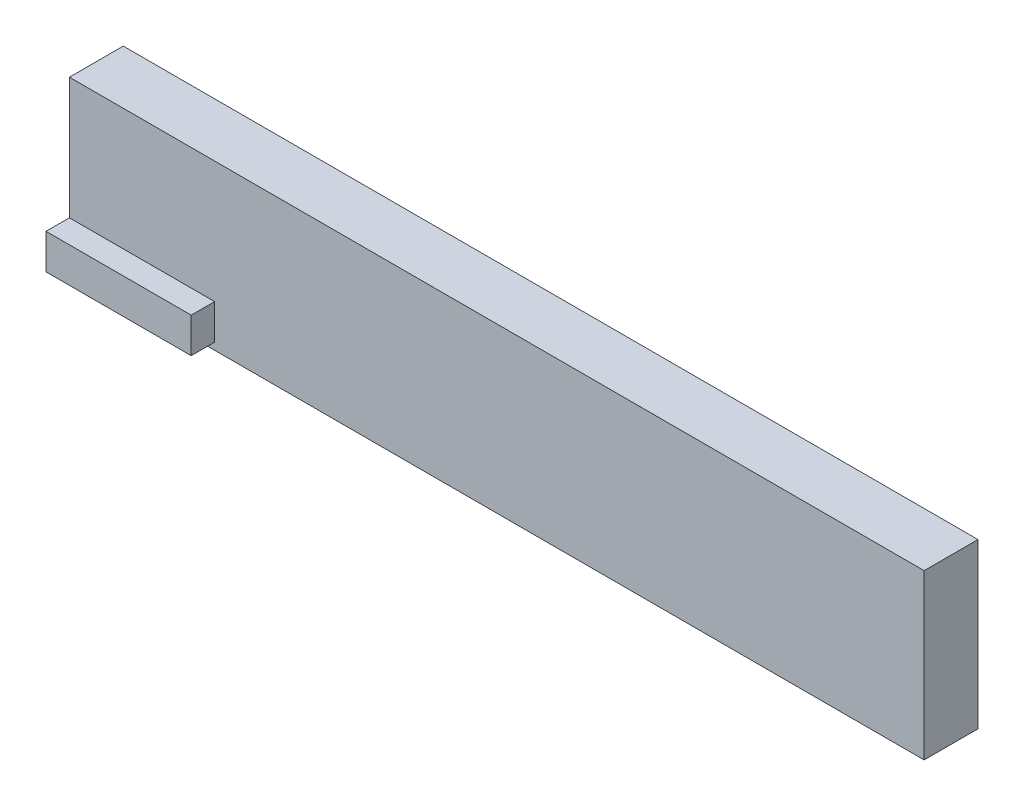
ISO-10303-21;
HEADER;
FILE_DESCRIPTION(('STEP AP214'),'2;1');
FILE_NAME('part.step','',(''),(''),'','','');
FILE_SCHEMA(('AUTOMOTIVE_DESIGN { 1 0 10303 214 1 1 1 1 }'));
ENDSEC;
DATA;
#1=APPLICATION_CONTEXT('core data for automotive mechanical design processes');
#2=APPLICATION_PROTOCOL_DEFINITION('international standard','automotive_design',2000,#1);
#3=PRODUCT_CONTEXT('',#1,'mechanical');
#4=PRODUCT('Part','Part','',(#3));
#5=PRODUCT_RELATED_PRODUCT_CATEGORY('part','',(#4));
#6=PRODUCT_DEFINITION_FORMATION('','',#4);
#7=PRODUCT_DEFINITION_CONTEXT('part definition',#1,'design');
#8=PRODUCT_DEFINITION('design','',#6,#7);
#9=PRODUCT_DEFINITION_SHAPE('','',#8);
#10=(LENGTH_UNIT() NAMED_UNIT(*) SI_UNIT(.MILLI.,.METRE.));
#11=(NAMED_UNIT(*) PLANE_ANGLE_UNIT() SI_UNIT($,.RADIAN.));
#12=(NAMED_UNIT(*) SI_UNIT($,.STERADIAN.) SOLID_ANGLE_UNIT());
#13=UNCERTAINTY_MEASURE_WITH_UNIT(LENGTH_MEASURE(1.E-05),#10,'distance_accuracy_value','');
#14=(GEOMETRIC_REPRESENTATION_CONTEXT(3) GLOBAL_UNCERTAINTY_ASSIGNED_CONTEXT((#13)) GLOBAL_UNIT_ASSIGNED_CONTEXT((#10,
#11,#12)) REPRESENTATION_CONTEXT('',''));
#15=CARTESIAN_POINT('',(0.,0.,0.));
#16=DIRECTION('',(0.,0.,1.));
#17=DIRECTION('',(1.,0.,0.));
#18=AXIS2_PLACEMENT_3D('',#15,#16,#17);
#19=CARTESIAN_POINT('',(0.,0.,2.30000000000002));
#20=DIRECTION('',(1.,0.,0.));
#21=DIRECTION('',(0.,1.,0.));
#22=AXIS2_PLACEMENT_3D('',#19,#20,#21);
#23=PLANE('',#22);
#24=CARTESIAN_POINT('',(0.,-5.9343279526015,2.77991268216593));
#25=DIRECTION('',(-1.,0.,0.));
#26=DIRECTION('',(0.,-1.,0.));
#27=AXIS2_PLACEMENT_3D('',#24,#25,#26);
#28=CIRCLE('',#27,0.5);
#29=CARTESIAN_POINT('',(0.,-6.4343279526015,2.77991268216593));
#30=VERTEX_POINT('',#29);
#31=EDGE_CURVE('E207',#30,#30,#28,.T.);
#32=ORIENTED_EDGE('',*,*,#31,.F.);
#33=EDGE_LOOP('',(#32));
#34=FACE_BOUND('',#33,.T.);
#35=DIRECTION('',(0.,-1.,0.));
#36=VECTOR('',#35,1.);
#37=CARTESIAN_POINT('',(0.,0.,0.));
#38=LINE('',#37,#36);
#39=CARTESIAN_POINT('',(0.,0.,0.));
#40=VERTEX_POINT('',#39);
#41=CARTESIAN_POINT('',(1.2490009027033E-13,-7.00000000000012,-1.38777878078145E-13));
#42=VERTEX_POINT('',#41);
#43=EDGE_CURVE('E126',#40,#42,#38,.T.);
#44=ORIENTED_EDGE('',*,*,#43,.T.);
#45=DIRECTION('',(0.,0.,-1.));
#46=VECTOR('',#45,1.);
#47=CARTESIAN_POINT('',(0.,-7.00000000000001,2.3));
#48=LINE('',#47,#46);
#49=CARTESIAN_POINT('',(0.,-7.00000000000001,2.3));
#50=VERTEX_POINT('',#49);
#51=EDGE_CURVE('E11',#50,#42,#48,.T.);
#52=ORIENTED_EDGE('',*,*,#51,.F.);
#53=DIRECTION('',(0.,-1.,0.));
#54=VECTOR('',#53,1.);
#55=CARTESIAN_POINT('',(0.,0.,2.30000000000002));
#56=LINE('',#55,#54);
#57=CARTESIAN_POINT('',(0.,-6.70000000000001,2.3));
#58=VERTEX_POINT('',#57);
#59=EDGE_CURVE('E124',#58,#50,#56,.T.);
#60=ORIENTED_EDGE('',*,*,#59,.F.);
#61=DIRECTION('',(0.,0.,-1.));
#62=VECTOR('',#61,1.);
#63=CARTESIAN_POINT('',(1.38777878078145E-13,-6.70000000000001,3.3));
#64=LINE('',#63,#62);
#65=CARTESIAN_POINT('',(1.38777878078145E-13,-6.70000000000001,3.3));
#66=VERTEX_POINT('',#65);
#67=EDGE_CURVE('E104',#66,#58,#64,.T.);
#68=ORIENTED_EDGE('',*,*,#67,.F.);
#69=DIRECTION('',(0.,-1.,0.));
#70=VECTOR('',#69,1.);
#71=CARTESIAN_POINT('',(1.31838984174237E-13,-5.20000000000007,3.3));
#72=LINE('',#71,#70);
#73=CARTESIAN_POINT('',(1.31838984174237E-13,-5.20000000000007,3.3));
#74=VERTEX_POINT('',#73);
#75=EDGE_CURVE('E111',#74,#66,#72,.T.);
#76=ORIENTED_EDGE('',*,*,#75,.F.);
#77=DIRECTION('',(0.,0.,-1.));
#78=VECTOR('',#77,1.);
#79=CARTESIAN_POINT('',(1.31838984174237E-13,-5.20000000000007,3.3));
#80=LINE('',#79,#78);
#81=CARTESIAN_POINT('',(0.,-5.20000000000005,2.30000000000027));
#82=VERTEX_POINT('',#81);
#83=EDGE_CURVE('E185',#74,#82,#80,.T.);
#84=ORIENTED_EDGE('',*,*,#83,.T.);
#85=CARTESIAN_POINT('',(0.,0.,2.30000000000002));
#86=VERTEX_POINT('',#85);
#87=EDGE_CURVE('E138',#86,#82,#56,.T.);
#88=ORIENTED_EDGE('',*,*,#87,.F.);
#89=DIRECTION('',(0.,0.,-1.));
#90=VECTOR('',#89,1.);
#91=CARTESIAN_POINT('',(0.,0.,2.30000000000002));
#92=LINE('',#91,#90);
#93=EDGE_CURVE('E149',#86,#40,#92,.T.);
#94=ORIENTED_EDGE('',*,*,#93,.T.);
#95=EDGE_LOOP('',(#44,#52,#60,#68,#76,#84,#88,#94));
#96=FACE_BOUND('',#95,.T.);
#97=ADVANCED_FACE('F36',(#34,#96),#23,.F.);
#98=CARTESIAN_POINT('',(0.,-7.00000000000001,2.3));
#99=DIRECTION('',(0.,1.,0.));
#100=DIRECTION('',(0.,0.,1.));
#101=AXIS2_PLACEMENT_3D('',#98,#99,#100);
#102=PLANE('',#101);
#103=DIRECTION('',(1.,0.,0.));
#104=VECTOR('',#103,1.);
#105=CARTESIAN_POINT('',(1.2490009027033E-13,-7.00000000000012,-1.38777878078145E-13));
#106=LINE('',#105,#104);
#107=CARTESIAN_POINT('',(36.5000000000001,-6.99999999999999,2.22044604925031E-13));
#108=VERTEX_POINT('',#107);
#109=EDGE_CURVE('E131',#42,#108,#106,.T.);
#110=ORIENTED_EDGE('',*,*,#109,.T.);
#111=DIRECTION('',(0.,0.,-1.));
#112=VECTOR('',#111,1.);
#113=CARTESIAN_POINT('',(36.5000000000001,-7.00000000000002,2.29999999999994));
#114=LINE('',#113,#112);
#115=CARTESIAN_POINT('',(36.5000000000001,-7.00000000000002,2.29999999999994));
#116=VERTEX_POINT('',#115);
#117=EDGE_CURVE('E44',#116,#108,#114,.T.);
#118=ORIENTED_EDGE('',*,*,#117,.F.);
#119=DIRECTION('',(1.,0.,0.));
#120=VECTOR('',#119,1.);
#121=CARTESIAN_POINT('',(0.,-7.00000000000001,2.3));
#122=LINE('',#121,#120);
#123=EDGE_CURVE('E141',#50,#116,#122,.T.);
#124=ORIENTED_EDGE('',*,*,#123,.F.);
#125=ORIENTED_EDGE('',*,*,#51,.T.);
#126=EDGE_LOOP('',(#110,#118,#124,#125));
#127=FACE_BOUND('',#126,.T.);
#128=ADVANCED_FACE('F218',(#127),#102,.F.);
#129=CARTESIAN_POINT('',(36.5000000000001,0.,2.29999999999994));
#130=DIRECTION('',(-1.,0.,0.));
#131=DIRECTION('',(0.,0.,1.));
#132=AXIS2_PLACEMENT_3D('',#129,#130,#131);
#133=PLANE('',#132);
#134=DIRECTION('',(0.,1.,0.));
#135=VECTOR('',#134,1.);
#136=CARTESIAN_POINT('',(36.5000000000001,0.,0.));
#137=LINE('',#136,#135);
#138=CARTESIAN_POINT('',(36.5000000000001,0.,0.));
#139=VERTEX_POINT('',#138);
#140=EDGE_CURVE('E153',#108,#139,#137,.T.);
#141=ORIENTED_EDGE('',*,*,#140,.T.);
#142=DIRECTION('',(0.,0.,-1.));
#143=VECTOR('',#142,1.);
#144=CARTESIAN_POINT('',(36.5000000000001,0.,2.29999999999994));
#145=LINE('',#144,#143);
#146=CARTESIAN_POINT('',(36.5000000000001,0.,2.29999999999994));
#147=VERTEX_POINT('',#146);
#148=EDGE_CURVE('E162',#147,#139,#145,.T.);
#149=ORIENTED_EDGE('',*,*,#148,.F.);
#150=DIRECTION('',(0.,1.,0.));
#151=VECTOR('',#150,1.);
#152=CARTESIAN_POINT('',(36.5000000000001,0.,2.29999999999994));
#153=LINE('',#152,#151);
#154=EDGE_CURVE('E144',#116,#147,#153,.T.);
#155=ORIENTED_EDGE('',*,*,#154,.F.);
#156=ORIENTED_EDGE('',*,*,#117,.T.);
#157=EDGE_LOOP('',(#141,#149,#155,#156));
#158=FACE_BOUND('',#157,.T.);
#159=ADVANCED_FACE('F172',(#158),#133,.F.);
#160=CARTESIAN_POINT('',(0.,0.,2.30000000000002));
#161=DIRECTION('',(0.,-1.,0.));
#162=DIRECTION('',(0.,0.,-1.));
#163=AXIS2_PLACEMENT_3D('',#160,#161,#162);
#164=PLANE('',#163);
#165=DIRECTION('',(-1.,0.,0.));
#166=VECTOR('',#165,1.);
#167=CARTESIAN_POINT('',(0.,0.,0.));
#168=LINE('',#167,#166);
#169=EDGE_CURVE('E156',#139,#40,#168,.T.);
#170=ORIENTED_EDGE('',*,*,#169,.T.);
#171=ORIENTED_EDGE('',*,*,#93,.F.);
#172=DIRECTION('',(-1.,0.,0.));
#173=VECTOR('',#172,1.);
#174=CARTESIAN_POINT('',(0.,0.,2.30000000000002));
#175=LINE('',#174,#173);
#176=EDGE_CURVE('E147',#147,#86,#175,.T.);
#177=ORIENTED_EDGE('',*,*,#176,.F.);
#178=ORIENTED_EDGE('',*,*,#148,.T.);
#179=EDGE_LOOP('',(#170,#171,#177,#178));
#180=FACE_BOUND('',#179,.T.);
#181=ADVANCED_FACE('F182',(#180),#164,.F.);
#182=CARTESIAN_POINT('',(0.,0.,2.30000000000002));
#183=DIRECTION('',(0.,0.,1.));
#184=DIRECTION('',(1.,0.,0.));
#185=AXIS2_PLACEMENT_3D('',#182,#183,#184);
#186=PLANE('',#185);
#187=DIRECTION('',(-1.,0.,0.));
#188=VECTOR('',#187,1.);
#189=CARTESIAN_POINT('',(0.,-5.20000000000005,2.30000000000027));
#190=LINE('',#189,#188);
#191=CARTESIAN_POINT('',(6.19999999999999,-5.20000000000001,2.30000000000027));
#192=VERTEX_POINT('',#191);
#193=EDGE_CURVE('E51',#192,#82,#190,.T.);
#194=ORIENTED_EDGE('',*,*,#193,.F.);
#195=DIRECTION('',(0.,1.,0.));
#196=VECTOR('',#195,1.);
#197=CARTESIAN_POINT('',(6.19999999999999,-5.20000000000001,2.30000000000027));
#198=LINE('',#197,#196);
#199=CARTESIAN_POINT('',(6.20000000000012,-6.7000000000001,2.30000000000027));
#200=VERTEX_POINT('',#199);
#201=EDGE_CURVE('E192',#200,#192,#198,.T.);
#202=ORIENTED_EDGE('',*,*,#201,.F.);
#203=DIRECTION('',(1.,0.,0.));
#204=VECTOR('',#203,1.);
#205=CARTESIAN_POINT('',(0.,-6.70000000000001,2.3));
#206=LINE('',#205,#204);
#207=EDGE_CURVE('E57',#58,#200,#206,.T.);
#208=ORIENTED_EDGE('',*,*,#207,.F.);
#209=ORIENTED_EDGE('',*,*,#59,.T.);
#210=ORIENTED_EDGE('',*,*,#123,.T.);
#211=ORIENTED_EDGE('',*,*,#154,.T.);
#212=ORIENTED_EDGE('',*,*,#176,.T.);
#213=ORIENTED_EDGE('',*,*,#87,.T.);
#214=EDGE_LOOP('',(#194,#202,#208,#209,#210,#211,#212,#213));
#215=FACE_BOUND('',#214,.T.);
#216=ADVANCED_FACE('F186',(#215),#186,.T.);
#217=CARTESIAN_POINT('',(0.,0.,0.));
#218=DIRECTION('',(0.,0.,1.));
#219=DIRECTION('',(1.,0.,0.));
#220=AXIS2_PLACEMENT_3D('',#217,#218,#219);
#221=PLANE('',#220);
#222=ORIENTED_EDGE('',*,*,#43,.F.);
#223=ORIENTED_EDGE('',*,*,#169,.F.);
#224=ORIENTED_EDGE('',*,*,#140,.F.);
#225=ORIENTED_EDGE('',*,*,#109,.F.);
#226=EDGE_LOOP('',(#222,#223,#224,#225));
#227=FACE_BOUND('',#226,.T.);
#228=ADVANCED_FACE('F179',(#227),#221,.F.);
#229=CARTESIAN_POINT('',(1.38777878078145E-13,-6.70000000000001,3.3));
#230=DIRECTION('',(0.,1.,0.));
#231=DIRECTION('',(0.,0.,1.));
#232=AXIS2_PLACEMENT_3D('',#229,#230,#231);
#233=PLANE('',#232);
#234=ORIENTED_EDGE('',*,*,#207,.T.);
#235=DIRECTION('',(0.,0.,-1.));
#236=VECTOR('',#235,1.);
#237=CARTESIAN_POINT('',(6.20000000000003,-6.70000000000007,3.3));
#238=LINE('',#237,#236);
#239=CARTESIAN_POINT('',(6.20000000000003,-6.70000000000007,3.3));
#240=VERTEX_POINT('',#239);
#241=EDGE_CURVE('E106',#240,#200,#238,.T.);
#242=ORIENTED_EDGE('',*,*,#241,.F.);
#243=DIRECTION('',(1.,0.,0.));
#244=VECTOR('',#243,1.);
#245=CARTESIAN_POINT('',(1.38777878078145E-13,-6.70000000000001,3.3));
#246=LINE('',#245,#244);
#247=EDGE_CURVE('E100',#66,#240,#246,.T.);
#248=ORIENTED_EDGE('',*,*,#247,.F.);
#249=ORIENTED_EDGE('',*,*,#67,.T.);
#250=EDGE_LOOP('',(#234,#242,#248,#249));
#251=FACE_BOUND('',#250,.T.);
#252=ADVANCED_FACE('F102',(#251),#233,.F.);
#253=CARTESIAN_POINT('',(6.20000000000014,-5.20000000000001,3.3));
#254=DIRECTION('',(-1.,0.,0.));
#255=DIRECTION('',(0.,0.,1.));
#256=AXIS2_PLACEMENT_3D('',#253,#254,#255);
#257=PLANE('',#256);
#258=ORIENTED_EDGE('',*,*,#201,.T.);
#259=DIRECTION('',(0.,0.,-1.));
#260=VECTOR('',#259,1.);
#261=CARTESIAN_POINT('',(6.20000000000014,-5.20000000000001,3.3));
#262=LINE('',#261,#260);
#263=CARTESIAN_POINT('',(6.20000000000014,-5.20000000000001,3.3));
#264=VERTEX_POINT('',#263);
#265=EDGE_CURVE('E134',#264,#192,#262,.T.);
#266=ORIENTED_EDGE('',*,*,#265,.F.);
#267=DIRECTION('',(0.,1.,0.));
#268=VECTOR('',#267,1.);
#269=CARTESIAN_POINT('',(6.20000000000014,-5.20000000000001,3.3));
#270=LINE('',#269,#268);
#271=EDGE_CURVE('E110',#240,#264,#270,.T.);
#272=ORIENTED_EDGE('',*,*,#271,.F.);
#273=ORIENTED_EDGE('',*,*,#241,.T.);
#274=EDGE_LOOP('',(#258,#266,#272,#273));
#275=FACE_BOUND('',#274,.T.);
#276=ADVANCED_FACE('F235',(#275),#257,.F.);
#277=CARTESIAN_POINT('',(1.31838984174237E-13,-5.20000000000007,3.3));
#278=DIRECTION('',(0.,-1.,0.));
#279=DIRECTION('',(0.,0.,-1.));
#280=AXIS2_PLACEMENT_3D('',#277,#278,#279);
#281=PLANE('',#280);
#282=ORIENTED_EDGE('',*,*,#193,.T.);
#283=ORIENTED_EDGE('',*,*,#83,.F.);
#284=DIRECTION('',(-1.,0.,0.));
#285=VECTOR('',#284,1.);
#286=CARTESIAN_POINT('',(1.31838984174237E-13,-5.20000000000007,3.3));
#287=LINE('',#286,#285);
#288=EDGE_CURVE('E116',#264,#74,#287,.T.);
#289=ORIENTED_EDGE('',*,*,#288,.F.);
#290=ORIENTED_EDGE('',*,*,#265,.T.);
#291=EDGE_LOOP('',(#282,#283,#289,#290));
#292=FACE_BOUND('',#291,.T.);
#293=ADVANCED_FACE('F189',(#292),#281,.F.);
#294=CARTESIAN_POINT('',(0.,0.,3.30000000000005));
#295=DIRECTION('',(0.,0.,1.));
#296=DIRECTION('',(1.,0.,0.));
#297=AXIS2_PLACEMENT_3D('',#294,#295,#296);
#298=PLANE('',#297);
#299=ORIENTED_EDGE('',*,*,#75,.T.);
#300=ORIENTED_EDGE('',*,*,#247,.T.);
#301=ORIENTED_EDGE('',*,*,#271,.T.);
#302=ORIENTED_EDGE('',*,*,#288,.T.);
#303=EDGE_LOOP('',(#299,#300,#301,#302));
#304=FACE_BOUND('',#303,.T.);
#305=ADVANCED_FACE('F114',(#304),#298,.T.);
#306=CARTESIAN_POINT('',(1.00000000000002,-5.93432795260146,2.77991268216565));
#307=DIRECTION('',(-1.,0.,0.));
#308=DIRECTION('',(0.,-1.,0.));
#309=AXIS2_PLACEMENT_3D('',#306,#307,#308);
#310=CYLINDRICAL_SURFACE('',#309,0.5);
#311=CARTESIAN_POINT('',(1.00000000000002,-5.93432795260146,2.77991268216565));
#312=DIRECTION('',(-1.,0.,0.));
#313=DIRECTION('',(0.,-1.,0.));
#314=AXIS2_PLACEMENT_3D('',#311,#312,#313);
#315=CIRCLE('',#314,0.5);
#316=CARTESIAN_POINT('',(1.00000000000002,-6.43432795260146,2.77991268216565));
#317=VERTEX_POINT('',#316);
#318=EDGE_CURVE('E204',#317,#317,#315,.T.);
#319=ORIENTED_EDGE('',*,*,#318,.F.);
#320=EDGE_LOOP('',(#319));
#321=FACE_BOUND('',#320,.T.);
#322=ORIENTED_EDGE('',*,*,#31,.T.);
#323=EDGE_LOOP('',(#322));
#324=FACE_BOUND('',#323,.T.);
#325=ADVANCED_FACE('F215',(#321,#324),#310,.F.);
#326=CARTESIAN_POINT('',(1.00000000000002,-5.93432795260146,2.77991268216565));
#327=DIRECTION('',(-1.,0.,0.));
#328=DIRECTION('',(0.,-1.,0.));
#329=AXIS2_PLACEMENT_3D('',#326,#327,#328);
#330=PLANE('',#329);
#331=ORIENTED_EDGE('',*,*,#318,.T.);
#332=EDGE_LOOP('',(#331));
#333=FACE_BOUND('',#332,.T.);
#334=ADVANCED_FACE('F245',(#333),#330,.T.);
#335=CLOSED_SHELL('',(#97,#128,#159,#181,#216,#228,#252,#276,#293,#305,#325,#334));
#336=MANIFOLD_SOLID_BREP('B2',#335);
#337=ADVANCED_BREP_SHAPE_REPRESENTATION('',(#18,#336),#14);
#338=SHAPE_DEFINITION_REPRESENTATION(#9,#337);
ENDSEC;
END-ISO-10303-21;
